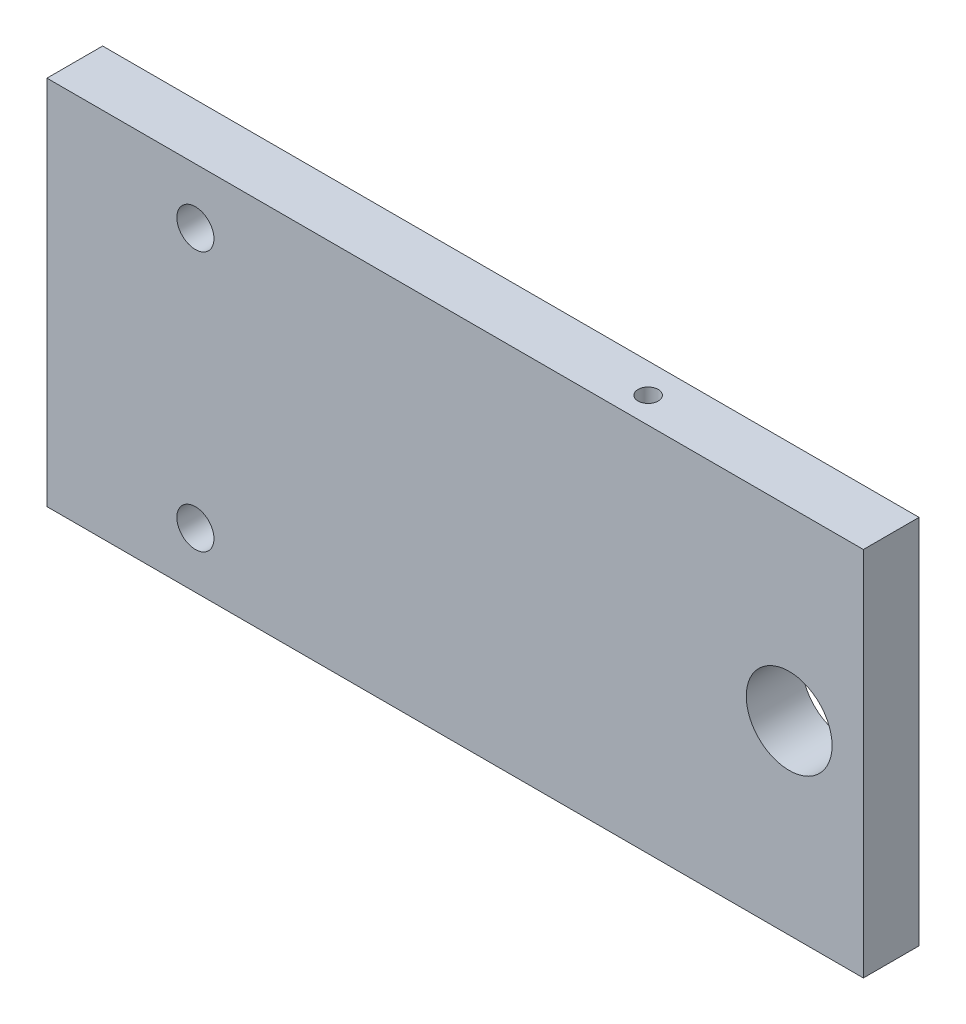
ISO-10303-21;
HEADER;
FILE_DESCRIPTION(('STEP AP214'),'2;1');
FILE_NAME('part.step','',(''),(''),'','','');
FILE_SCHEMA(('AUTOMOTIVE_DESIGN { 1 0 10303 214 1 1 1 1 }'));
ENDSEC;
DATA;
#1=APPLICATION_CONTEXT('core data for automotive mechanical design processes');
#2=APPLICATION_PROTOCOL_DEFINITION('international standard','automotive_design',2000,#1);
#3=PRODUCT_CONTEXT('',#1,'mechanical');
#4=PRODUCT('Part','Part','',(#3));
#5=PRODUCT_RELATED_PRODUCT_CATEGORY('part','',(#4));
#6=PRODUCT_DEFINITION_FORMATION('','',#4);
#7=PRODUCT_DEFINITION_CONTEXT('part definition',#1,'design');
#8=PRODUCT_DEFINITION('design','',#6,#7);
#9=PRODUCT_DEFINITION_SHAPE('','',#8);
#10=(LENGTH_UNIT() NAMED_UNIT(*) SI_UNIT(.MILLI.,.METRE.));
#11=(NAMED_UNIT(*) PLANE_ANGLE_UNIT() SI_UNIT($,.RADIAN.));
#12=(NAMED_UNIT(*) SI_UNIT($,.STERADIAN.) SOLID_ANGLE_UNIT());
#13=UNCERTAINTY_MEASURE_WITH_UNIT(LENGTH_MEASURE(1.E-05),#10,'distance_accuracy_value','');
#14=(GEOMETRIC_REPRESENTATION_CONTEXT(3) GLOBAL_UNCERTAINTY_ASSIGNED_CONTEXT((#13)) GLOBAL_UNIT_ASSIGNED_CONTEXT((#10,
#11,#12)) REPRESENTATION_CONTEXT('',''));
#15=CARTESIAN_POINT('',(0.,0.,0.));
#16=DIRECTION('',(0.,0.,1.));
#17=DIRECTION('',(1.,0.,0.));
#18=AXIS2_PLACEMENT_3D('',#15,#16,#17);
#19=CARTESIAN_POINT('',(0.,0.,9.525));
#20=DIRECTION('',(1.,0.,0.));
#21=DIRECTION('',(0.,0.,-1.));
#22=AXIS2_PLACEMENT_3D('',#19,#20,#21);
#23=PLANE('',#22);
#24=DIRECTION('',(0.,-1.,0.));
#25=VECTOR('',#24,1.);
#26=CARTESIAN_POINT('',(0.,0.,0.));
#27=LINE('',#26,#25);
#28=CARTESIAN_POINT('',(0.,63.5,0.));
#29=VERTEX_POINT('',#28);
#30=CARTESIAN_POINT('',(0.,0.,0.));
#31=VERTEX_POINT('',#30);
#32=EDGE_CURVE('E136',#29,#31,#27,.T.);
#33=ORIENTED_EDGE('',*,*,#32,.T.);
#34=DIRECTION('',(0.,0.,-1.));
#35=VECTOR('',#34,1.);
#36=CARTESIAN_POINT('',(0.,0.,9.525));
#37=LINE('',#36,#35);
#38=CARTESIAN_POINT('',(0.,0.,9.525));
#39=VERTEX_POINT('',#38);
#40=EDGE_CURVE('E11',#39,#31,#37,.T.);
#41=ORIENTED_EDGE('',*,*,#40,.F.);
#42=DIRECTION('',(0.,-1.,0.));
#43=VECTOR('',#42,1.);
#44=CARTESIAN_POINT('',(0.,0.,9.525));
#45=LINE('',#44,#43);
#46=CARTESIAN_POINT('',(0.,63.5,9.525));
#47=VERTEX_POINT('',#46);
#48=EDGE_CURVE('E137',#47,#39,#45,.T.);
#49=ORIENTED_EDGE('',*,*,#48,.F.);
#50=DIRECTION('',(0.,0.,-1.));
#51=VECTOR('',#50,1.);
#52=CARTESIAN_POINT('',(0.,63.5,9.525));
#53=LINE('',#52,#51);
#54=EDGE_CURVE('E147',#47,#29,#53,.T.);
#55=ORIENTED_EDGE('',*,*,#54,.T.);
#56=EDGE_LOOP('',(#33,#41,#49,#55));
#57=FACE_BOUND('',#56,.T.);
#58=ADVANCED_FACE('F43',(#57),#23,.F.);
#59=CARTESIAN_POINT('',(0.,0.,9.525));
#60=DIRECTION('',(0.,1.,0.));
#61=DIRECTION('',(0.,0.,1.));
#62=AXIS2_PLACEMENT_3D('',#59,#60,#61);
#63=PLANE('',#62);
#64=DIRECTION('',(1.,0.,0.));
#65=VECTOR('',#64,1.);
#66=CARTESIAN_POINT('',(0.,0.,0.));
#67=LINE('',#66,#65);
#68=CARTESIAN_POINT('',(139.7,0.,0.));
#69=VERTEX_POINT('',#68);
#70=EDGE_CURVE('E151',#31,#69,#67,.T.);
#71=ORIENTED_EDGE('',*,*,#70,.T.);
#72=DIRECTION('',(0.,0.,-1.));
#73=VECTOR('',#72,1.);
#74=CARTESIAN_POINT('',(139.7,0.,9.525));
#75=LINE('',#74,#73);
#76=CARTESIAN_POINT('',(139.7,0.,9.525));
#77=VERTEX_POINT('',#76);
#78=EDGE_CURVE('E52',#77,#69,#75,.T.);
#79=ORIENTED_EDGE('',*,*,#78,.F.);
#80=DIRECTION('',(1.,0.,0.));
#81=VECTOR('',#80,1.);
#82=CARTESIAN_POINT('',(0.,0.,9.525));
#83=LINE('',#82,#81);
#84=EDGE_CURVE('E91',#39,#77,#83,.T.);
#85=ORIENTED_EDGE('',*,*,#84,.F.);
#86=ORIENTED_EDGE('',*,*,#40,.T.);
#87=EDGE_LOOP('',(#71,#79,#85,#86));
#88=FACE_BOUND('',#87,.T.);
#89=ADVANCED_FACE('F182',(#88),#63,.F.);
#90=CARTESIAN_POINT('',(139.7,0.,9.525));
#91=DIRECTION('',(-1.,0.,0.));
#92=DIRECTION('',(0.,0.,1.));
#93=AXIS2_PLACEMENT_3D('',#90,#91,#92);
#94=PLANE('',#93);
#95=DIRECTION('',(0.,1.,0.));
#96=VECTOR('',#95,1.);
#97=CARTESIAN_POINT('',(139.7,0.,0.));
#98=LINE('',#97,#96);
#99=CARTESIAN_POINT('',(139.7,63.5,0.));
#100=VERTEX_POINT('',#99);
#101=EDGE_CURVE('E78',#69,#100,#98,.T.);
#102=ORIENTED_EDGE('',*,*,#101,.T.);
#103=DIRECTION('',(0.,0.,-1.));
#104=VECTOR('',#103,1.);
#105=CARTESIAN_POINT('',(139.7,63.5,9.525));
#106=LINE('',#105,#104);
#107=CARTESIAN_POINT('',(139.7,63.5,9.525));
#108=VERTEX_POINT('',#107);
#109=EDGE_CURVE('E160',#108,#100,#106,.T.);
#110=ORIENTED_EDGE('',*,*,#109,.F.);
#111=DIRECTION('',(0.,1.,0.));
#112=VECTOR('',#111,1.);
#113=CARTESIAN_POINT('',(139.7,0.,9.525));
#114=LINE('',#113,#112);
#115=EDGE_CURVE('E142',#77,#108,#114,.T.);
#116=ORIENTED_EDGE('',*,*,#115,.F.);
#117=ORIENTED_EDGE('',*,*,#78,.T.);
#118=EDGE_LOOP('',(#102,#110,#116,#117));
#119=FACE_BOUND('',#118,.T.);
#120=ADVANCED_FACE('F164',(#119),#94,.F.);
#121=CARTESIAN_POINT('',(0.,63.5,9.525));
#122=DIRECTION('',(0.,-1.,0.));
#123=DIRECTION('',(0.,0.,-1.));
#124=AXIS2_PLACEMENT_3D('',#121,#122,#123);
#125=PLANE('',#124);
#126=CARTESIAN_POINT('',(98.425,63.5,5.08));
#127=DIRECTION('',(0.,1.,0.));
#128=DIRECTION('',(0.,0.,1.));
#129=AXIS2_PLACEMENT_3D('',#126,#127,#128);
#130=CIRCLE('',#129,1.7272);
#131=CARTESIAN_POINT('',(98.425,63.5,6.8072));
#132=VERTEX_POINT('',#131);
#133=EDGE_CURVE('E107',#132,#132,#130,.T.);
#134=ORIENTED_EDGE('',*,*,#133,.F.);
#135=EDGE_LOOP('',(#134));
#136=FACE_BOUND('',#135,.T.);
#137=DIRECTION('',(-1.,0.,0.));
#138=VECTOR('',#137,1.);
#139=CARTESIAN_POINT('',(0.,63.5,0.));
#140=LINE('',#139,#138);
#141=EDGE_CURVE('E84',#100,#29,#140,.T.);
#142=ORIENTED_EDGE('',*,*,#141,.T.);
#143=ORIENTED_EDGE('',*,*,#54,.F.);
#144=DIRECTION('',(-1.,0.,0.));
#145=VECTOR('',#144,1.);
#146=CARTESIAN_POINT('',(0.,63.5,9.525));
#147=LINE('',#146,#145);
#148=EDGE_CURVE('E60',#108,#47,#147,.T.);
#149=ORIENTED_EDGE('',*,*,#148,.F.);
#150=ORIENTED_EDGE('',*,*,#109,.T.);
#151=EDGE_LOOP('',(#142,#143,#149,#150));
#152=FACE_BOUND('',#151,.T.);
#153=ADVANCED_FACE('F171',(#136,#152),#125,.F.);
#154=CARTESIAN_POINT('',(0.,0.,9.525));
#155=DIRECTION('',(0.,0.,-1.));
#156=DIRECTION('',(-1.,0.,0.));
#157=AXIS2_PLACEMENT_3D('',#154,#155,#156);
#158=PLANE('',#157);
#159=CARTESIAN_POINT('',(25.4,53.975,9.525));
#160=DIRECTION('',(0.,0.,1.));
#161=DIRECTION('',(1.,0.,0.));
#162=AXIS2_PLACEMENT_3D('',#159,#160,#161);
#163=CIRCLE('',#162,3.175);
#164=CARTESIAN_POINT('',(28.575,53.975,9.525));
#165=VERTEX_POINT('',#164);
#166=EDGE_CURVE('E106',#165,#165,#163,.T.);
#167=ORIENTED_EDGE('',*,*,#166,.F.);
#168=EDGE_LOOP('',(#167));
#169=FACE_BOUND('',#168,.T.);
#170=CARTESIAN_POINT('',(25.4,9.525,9.525));
#171=DIRECTION('',(0.,0.,1.));
#172=DIRECTION('',(1.,0.,0.));
#173=AXIS2_PLACEMENT_3D('',#170,#171,#172);
#174=CIRCLE('',#173,3.175);
#175=CARTESIAN_POINT('',(28.575,9.525,9.525));
#176=VERTEX_POINT('',#175);
#177=EDGE_CURVE('E120',#176,#176,#174,.T.);
#178=ORIENTED_EDGE('',*,*,#177,.F.);
#179=EDGE_LOOP('',(#178));
#180=FACE_BOUND('',#179,.T.);
#181=CARTESIAN_POINT('',(127.,31.75,9.525));
#182=DIRECTION('',(0.,0.,1.));
#183=DIRECTION('',(1.,0.,0.));
#184=AXIS2_PLACEMENT_3D('',#181,#182,#183);
#185=CIRCLE('',#184,7.34187);
#186=CARTESIAN_POINT('',(134.34187,31.75,9.525));
#187=VERTEX_POINT('',#186);
#188=EDGE_CURVE('E128',#187,#187,#185,.T.);
#189=ORIENTED_EDGE('',*,*,#188,.F.);
#190=EDGE_LOOP('',(#189));
#191=FACE_BOUND('',#190,.T.);
#192=ORIENTED_EDGE('',*,*,#48,.T.);
#193=ORIENTED_EDGE('',*,*,#84,.T.);
#194=ORIENTED_EDGE('',*,*,#115,.T.);
#195=ORIENTED_EDGE('',*,*,#148,.T.);
#196=EDGE_LOOP('',(#192,#193,#194,#195));
#197=FACE_BOUND('',#196,.T.);
#198=ADVANCED_FACE('F173',(#169,#180,#191,#197),#158,.F.);
#199=CARTESIAN_POINT('',(0.,0.,0.));
#200=DIRECTION('',(0.,0.,-1.));
#201=DIRECTION('',(-1.,0.,0.));
#202=AXIS2_PLACEMENT_3D('',#199,#200,#201);
#203=PLANE('',#202);
#204=CARTESIAN_POINT('',(25.4,53.975,0.));
#205=DIRECTION('',(0.,0.,1.));
#206=DIRECTION('',(1.,0.,0.));
#207=AXIS2_PLACEMENT_3D('',#204,#205,#206);
#208=CIRCLE('',#207,3.175);
#209=CARTESIAN_POINT('',(28.575,53.975,0.));
#210=VERTEX_POINT('',#209);
#211=EDGE_CURVE('E112',#210,#210,#208,.T.);
#212=ORIENTED_EDGE('',*,*,#211,.T.);
#213=EDGE_LOOP('',(#212));
#214=FACE_BOUND('',#213,.T.);
#215=CARTESIAN_POINT('',(25.4,9.525,0.));
#216=DIRECTION('',(0.,0.,1.));
#217=DIRECTION('',(1.,0.,0.));
#218=AXIS2_PLACEMENT_3D('',#215,#216,#217);
#219=CIRCLE('',#218,3.175);
#220=CARTESIAN_POINT('',(28.575,9.525,0.));
#221=VERTEX_POINT('',#220);
#222=EDGE_CURVE('E124',#221,#221,#219,.T.);
#223=ORIENTED_EDGE('',*,*,#222,.T.);
#224=EDGE_LOOP('',(#223));
#225=FACE_BOUND('',#224,.T.);
#226=CARTESIAN_POINT('',(127.,31.75,0.));
#227=DIRECTION('',(0.,0.,1.));
#228=DIRECTION('',(1.,0.,0.));
#229=AXIS2_PLACEMENT_3D('',#226,#227,#228);
#230=CIRCLE('',#229,7.34187);
#231=CARTESIAN_POINT('',(134.34187,31.75,0.));
#232=VERTEX_POINT('',#231);
#233=EDGE_CURVE('E132',#232,#232,#230,.T.);
#234=ORIENTED_EDGE('',*,*,#233,.T.);
#235=EDGE_LOOP('',(#234));
#236=FACE_BOUND('',#235,.T.);
#237=ORIENTED_EDGE('',*,*,#32,.F.);
#238=ORIENTED_EDGE('',*,*,#141,.F.);
#239=ORIENTED_EDGE('',*,*,#101,.F.);
#240=ORIENTED_EDGE('',*,*,#70,.F.);
#241=EDGE_LOOP('',(#237,#238,#239,#240));
#242=FACE_BOUND('',#241,.T.);
#243=ADVANCED_FACE('F167',(#214,#225,#236,#242),#203,.T.);
#244=CARTESIAN_POINT('',(127.,31.75,9.525));
#245=DIRECTION('',(0.,0.,1.));
#246=DIRECTION('',(1.,0.,0.));
#247=AXIS2_PLACEMENT_3D('',#244,#245,#246);
#248=CYLINDRICAL_SURFACE('',#247,7.34187);
#249=ORIENTED_EDGE('',*,*,#233,.F.);
#250=EDGE_LOOP('',(#249));
#251=FACE_BOUND('',#250,.T.);
#252=ORIENTED_EDGE('',*,*,#188,.T.);
#253=EDGE_LOOP('',(#252));
#254=FACE_BOUND('',#253,.T.);
#255=ADVANCED_FACE('F202',(#251,#254),#248,.F.);
#256=CARTESIAN_POINT('',(25.4,9.525,9.525));
#257=DIRECTION('',(0.,0.,1.));
#258=DIRECTION('',(1.,0.,0.));
#259=AXIS2_PLACEMENT_3D('',#256,#257,#258);
#260=CYLINDRICAL_SURFACE('',#259,3.175);
#261=ORIENTED_EDGE('',*,*,#222,.F.);
#262=EDGE_LOOP('',(#261));
#263=FACE_BOUND('',#262,.T.);
#264=ORIENTED_EDGE('',*,*,#177,.T.);
#265=EDGE_LOOP('',(#264));
#266=FACE_BOUND('',#265,.T.);
#267=ADVANCED_FACE('F208',(#263,#266),#260,.F.);
#268=CARTESIAN_POINT('',(25.4,53.975,9.525));
#269=DIRECTION('',(0.,0.,1.));
#270=DIRECTION('',(1.,0.,0.));
#271=AXIS2_PLACEMENT_3D('',#268,#269,#270);
#272=CYLINDRICAL_SURFACE('',#271,3.175);
#273=ORIENTED_EDGE('',*,*,#211,.F.);
#274=EDGE_LOOP('',(#273));
#275=FACE_BOUND('',#274,.T.);
#276=ORIENTED_EDGE('',*,*,#166,.T.);
#277=EDGE_LOOP('',(#276));
#278=FACE_BOUND('',#277,.T.);
#279=ADVANCED_FACE('F99',(#275,#278),#272,.F.);
#280=CARTESIAN_POINT('',(98.425,50.8,5.08));
#281=DIRECTION('',(0.,1.,0.));
#282=DIRECTION('',(0.,0.,1.));
#283=AXIS2_PLACEMENT_3D('',#280,#281,#282);
#284=CONICAL_SURFACE('',#283,1.7272,1.02974425867666);
#285=CARTESIAN_POINT('',(98.425,49.7621935388156,5.08));
#286=VERTEX_POINT('',#285);
#287=VERTEX_LOOP('',#286);
#288=FACE_BOUND('',#287,.T.);
#289=CARTESIAN_POINT('',(98.425,50.8,5.08));
#290=DIRECTION('',(0.,1.,0.));
#291=DIRECTION('',(0.,0.,1.));
#292=AXIS2_PLACEMENT_3D('',#289,#290,#291);
#293=CIRCLE('',#292,1.7272);
#294=CARTESIAN_POINT('',(98.425,50.8,6.8072));
#295=VERTEX_POINT('',#294);
#296=EDGE_CURVE('E103',#295,#295,#293,.T.);
#297=ORIENTED_EDGE('',*,*,#296,.T.);
#298=EDGE_LOOP('',(#297));
#299=FACE_BOUND('',#298,.T.);
#300=ADVANCED_FACE('F95',(#288,#299),#284,.F.);
#301=CARTESIAN_POINT('',(98.425,63.5,5.08));
#302=DIRECTION('',(0.,1.,0.));
#303=DIRECTION('',(0.,0.,1.));
#304=AXIS2_PLACEMENT_3D('',#301,#302,#303);
#305=CYLINDRICAL_SURFACE('',#304,1.7272);
#306=ORIENTED_EDGE('',*,*,#296,.F.);
#307=EDGE_LOOP('',(#306));
#308=FACE_BOUND('',#307,.T.);
#309=ORIENTED_EDGE('',*,*,#133,.T.);
#310=EDGE_LOOP('',(#309));
#311=FACE_BOUND('',#310,.T.);
#312=ADVANCED_FACE('F98',(#308,#311),#305,.F.);
#313=CLOSED_SHELL('',(#58,#89,#120,#153,#198,#243,#255,#267,#279,#300,#312));
#314=MANIFOLD_SOLID_BREP('B2',#313);
#315=ADVANCED_BREP_SHAPE_REPRESENTATION('',(#18,#314),#14);
#316=SHAPE_DEFINITION_REPRESENTATION(#9,#315);
ENDSEC;
END-ISO-10303-21;
